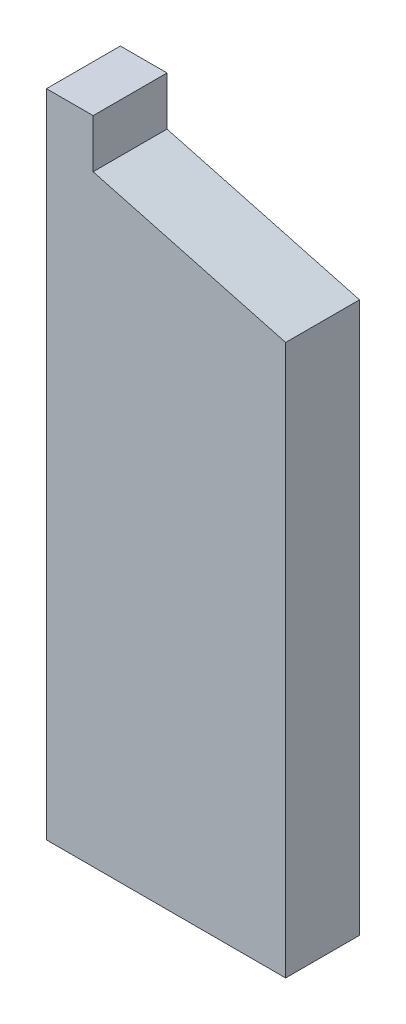
ISO-10303-21;
HEADER;
FILE_DESCRIPTION(('STEP AP214'),'2;1');
FILE_NAME('part.step','',(''),(''),'','','');
FILE_SCHEMA(('AUTOMOTIVE_DESIGN { 1 0 10303 214 1 1 1 1 }'));
ENDSEC;
DATA;
#1=APPLICATION_CONTEXT('core data for automotive mechanical design processes');
#2=APPLICATION_PROTOCOL_DEFINITION('international standard','automotive_design',2000,#1);
#3=PRODUCT_CONTEXT('',#1,'mechanical');
#4=PRODUCT('Part','Part','',(#3));
#5=PRODUCT_RELATED_PRODUCT_CATEGORY('part','',(#4));
#6=PRODUCT_DEFINITION_FORMATION('','',#4);
#7=PRODUCT_DEFINITION_CONTEXT('part definition',#1,'design');
#8=PRODUCT_DEFINITION('design','',#6,#7);
#9=PRODUCT_DEFINITION_SHAPE('','',#8);
#10=(LENGTH_UNIT() NAMED_UNIT(*) SI_UNIT(.MILLI.,.METRE.));
#11=(NAMED_UNIT(*) PLANE_ANGLE_UNIT() SI_UNIT($,.RADIAN.));
#12=(NAMED_UNIT(*) SI_UNIT($,.STERADIAN.) SOLID_ANGLE_UNIT());
#13=UNCERTAINTY_MEASURE_WITH_UNIT(LENGTH_MEASURE(1.E-05),#10,'distance_accuracy_value','');
#14=(GEOMETRIC_REPRESENTATION_CONTEXT(3) GLOBAL_UNCERTAINTY_ASSIGNED_CONTEXT((#13)) GLOBAL_UNIT_ASSIGNED_CONTEXT((#10,
#11,#12)) REPRESENTATION_CONTEXT('',''));
#15=CARTESIAN_POINT('',(0.,0.,0.));
#16=DIRECTION('',(0.,0.,1.));
#17=DIRECTION('',(1.,0.,0.));
#18=AXIS2_PLACEMENT_3D('',#15,#16,#17);
#19=CARTESIAN_POINT('',(24.6,0.,7.6));
#20=DIRECTION('',(1.,0.,0.));
#21=DIRECTION('',(0.,1.,0.));
#22=AXIS2_PLACEMENT_3D('',#19,#20,#21);
#23=PLANE('',#22);
#24=DIRECTION('',(0.,-1.,0.));
#25=VECTOR('',#24,1.);
#26=CARTESIAN_POINT('',(24.6,0.,0.));
#27=LINE('',#26,#25);
#28=CARTESIAN_POINT('',(24.6,-10.3053940101362,0.));
#29=VERTEX_POINT('',#28);
#30=CARTESIAN_POINT('',(24.6,-66.915,0.));
#31=VERTEX_POINT('',#30);
#32=EDGE_CURVE('E114',#29,#31,#27,.T.);
#33=ORIENTED_EDGE('',*,*,#32,.F.);
#34=DIRECTION('',(0.,0.,-1.));
#35=VECTOR('',#34,1.);
#36=CARTESIAN_POINT('',(24.6,-10.3053940101362,106.721924851358));
#37=LINE('',#36,#35);
#38=CARTESIAN_POINT('',(24.6,-10.3053940101362,7.6));
#39=VERTEX_POINT('',#38);
#40=EDGE_CURVE('E54',#39,#29,#37,.T.);
#41=ORIENTED_EDGE('',*,*,#40,.F.);
#42=DIRECTION('',(0.,-1.,0.));
#43=VECTOR('',#42,1.);
#44=CARTESIAN_POINT('',(24.6,0.,7.6));
#45=LINE('',#44,#43);
#46=CARTESIAN_POINT('',(24.6,-66.915,7.6));
#47=VERTEX_POINT('',#46);
#48=EDGE_CURVE('E119',#39,#47,#45,.T.);
#49=ORIENTED_EDGE('',*,*,#48,.T.);
#50=DIRECTION('',(0.,0.,-1.));
#51=VECTOR('',#50,1.);
#52=CARTESIAN_POINT('',(24.6,-66.915,7.6));
#53=LINE('',#52,#51);
#54=EDGE_CURVE('E121',#47,#31,#53,.T.);
#55=ORIENTED_EDGE('',*,*,#54,.T.);
#56=EDGE_LOOP('',(#33,#41,#49,#55));
#57=FACE_BOUND('',#56,.T.);
#58=ADVANCED_FACE('F39',(#57),#23,.T.);
#59=CARTESIAN_POINT('',(0.,0.,7.6));
#60=DIRECTION('',(0.,0.,1.));
#61=DIRECTION('',(1.,0.,0.));
#62=AXIS2_PLACEMENT_3D('',#59,#60,#61);
#63=PLANE('',#62);
#64=ORIENTED_EDGE('',*,*,#48,.F.);
#65=DIRECTION('',(-0.965925826289068,0.258819045102521,0.));
#66=VECTOR('',#65,1.);
#67=CARTESIAN_POINT('',(-0.928460969082654,-3.46506350946109,7.6));
#68=LINE('',#67,#66);
#69=CARTESIAN_POINT('',(4.8,-5.,7.6));
#70=VERTEX_POINT('',#69);
#71=EDGE_CURVE('E96',#39,#70,#68,.T.);
#72=ORIENTED_EDGE('',*,*,#71,.T.);
#73=DIRECTION('',(0.,-1.,0.));
#74=VECTOR('',#73,1.);
#75=CARTESIAN_POINT('',(4.8,0.,7.6));
#76=LINE('',#75,#74);
#77=CARTESIAN_POINT('',(4.8,0.,7.6));
#78=VERTEX_POINT('',#77);
#79=EDGE_CURVE('E101',#78,#70,#76,.T.);
#80=ORIENTED_EDGE('',*,*,#79,.F.);
#81=DIRECTION('',(1.,0.,0.));
#82=VECTOR('',#81,1.);
#83=CARTESIAN_POINT('',(0.,0.,7.6));
#84=LINE('',#83,#82);
#85=CARTESIAN_POINT('',(0.,0.,7.6));
#86=VERTEX_POINT('',#85);
#87=EDGE_CURVE('E109',#86,#78,#84,.T.);
#88=ORIENTED_EDGE('',*,*,#87,.F.);
#89=DIRECTION('',(0.,-1.,0.));
#90=VECTOR('',#89,1.);
#91=CARTESIAN_POINT('',(0.,0.,7.6));
#92=LINE('',#91,#90);
#93=CARTESIAN_POINT('',(0.,-66.915,7.6));
#94=VERTEX_POINT('',#93);
#95=EDGE_CURVE('E112',#86,#94,#92,.T.);
#96=ORIENTED_EDGE('',*,*,#95,.T.);
#97=DIRECTION('',(1.,0.,0.));
#98=VECTOR('',#97,1.);
#99=CARTESIAN_POINT('',(0.,-66.915,7.6));
#100=LINE('',#99,#98);
#101=EDGE_CURVE('E116',#94,#47,#100,.T.);
#102=ORIENTED_EDGE('',*,*,#101,.T.);
#103=EDGE_LOOP('',(#64,#72,#80,#88,#96,#102));
#104=FACE_BOUND('',#103,.T.);
#105=ADVANCED_FACE('F140',(#104),#63,.T.);
#106=CARTESIAN_POINT('',(0.,0.,0.));
#107=DIRECTION('',(0.,0.,1.));
#108=DIRECTION('',(1.,0.,0.));
#109=AXIS2_PLACEMENT_3D('',#106,#107,#108);
#110=PLANE('',#109);
#111=DIRECTION('',(-0.965925826289068,0.258819045102521,0.));
#112=VECTOR('',#111,1.);
#113=CARTESIAN_POINT('',(-0.928460969082654,-3.46506350946109,0.));
#114=LINE('',#113,#112);
#115=CARTESIAN_POINT('',(4.8,-5.,0.));
#116=VERTEX_POINT('',#115);
#117=EDGE_CURVE('E11',#29,#116,#114,.T.);
#118=ORIENTED_EDGE('',*,*,#117,.F.);
#119=ORIENTED_EDGE('',*,*,#32,.T.);
#120=DIRECTION('',(1.,0.,0.));
#121=VECTOR('',#120,1.);
#122=CARTESIAN_POINT('',(0.,-66.915,0.));
#123=LINE('',#122,#121);
#124=CARTESIAN_POINT('',(0.,-66.915,0.));
#125=VERTEX_POINT('',#124);
#126=EDGE_CURVE('E125',#125,#31,#123,.T.);
#127=ORIENTED_EDGE('',*,*,#126,.F.);
#128=DIRECTION('',(0.,-1.,0.));
#129=VECTOR('',#128,1.);
#130=CARTESIAN_POINT('',(0.,0.,0.));
#131=LINE('',#130,#129);
#132=CARTESIAN_POINT('',(0.,0.,0.));
#133=VERTEX_POINT('',#132);
#134=EDGE_CURVE('E122',#133,#125,#131,.T.);
#135=ORIENTED_EDGE('',*,*,#134,.F.);
#136=DIRECTION('',(1.,0.,0.));
#137=VECTOR('',#136,1.);
#138=CARTESIAN_POINT('',(0.,0.,0.));
#139=LINE('',#138,#137);
#140=CARTESIAN_POINT('',(4.8,0.,0.));
#141=VERTEX_POINT('',#140);
#142=EDGE_CURVE('E94',#133,#141,#139,.T.);
#143=ORIENTED_EDGE('',*,*,#142,.T.);
#144=DIRECTION('',(0.,-1.,0.));
#145=VECTOR('',#144,1.);
#146=CARTESIAN_POINT('',(4.8,0.,0.));
#147=LINE('',#146,#145);
#148=EDGE_CURVE('E89',#141,#116,#147,.T.);
#149=ORIENTED_EDGE('',*,*,#148,.T.);
#150=EDGE_LOOP('',(#118,#119,#127,#135,#143,#149));
#151=FACE_BOUND('',#150,.T.);
#152=ADVANCED_FACE('F91',(#151),#110,.F.);
#153=CARTESIAN_POINT('',(4.8,0.,7.6));
#154=DIRECTION('',(1.,0.,0.));
#155=DIRECTION('',(0.,1.,0.));
#156=AXIS2_PLACEMENT_3D('',#153,#154,#155);
#157=PLANE('',#156);
#158=ORIENTED_EDGE('',*,*,#148,.F.);
#159=DIRECTION('',(0.,0.,-1.));
#160=VECTOR('',#159,1.);
#161=CARTESIAN_POINT('',(4.8,0.,7.6));
#162=LINE('',#161,#160);
#163=EDGE_CURVE('E104',#78,#141,#162,.T.);
#164=ORIENTED_EDGE('',*,*,#163,.F.);
#165=ORIENTED_EDGE('',*,*,#79,.T.);
#166=DIRECTION('',(0.,0.,-1.));
#167=VECTOR('',#166,1.);
#168=CARTESIAN_POINT('',(4.8,-5.,7.6));
#169=LINE('',#168,#167);
#170=EDGE_CURVE('E47',#70,#116,#169,.T.);
#171=ORIENTED_EDGE('',*,*,#170,.T.);
#172=EDGE_LOOP('',(#158,#164,#165,#171));
#173=FACE_BOUND('',#172,.T.);
#174=ADVANCED_FACE('F41',(#173),#157,.T.);
#175=CARTESIAN_POINT('',(0.,0.,7.6));
#176=DIRECTION('',(0.,1.,0.));
#177=DIRECTION('',(-1.,0.,0.));
#178=AXIS2_PLACEMENT_3D('',#175,#176,#177);
#179=PLANE('',#178);
#180=ORIENTED_EDGE('',*,*,#142,.F.);
#181=DIRECTION('',(0.,0.,-1.));
#182=VECTOR('',#181,1.);
#183=CARTESIAN_POINT('',(0.,0.,7.6));
#184=LINE('',#183,#182);
#185=EDGE_CURVE('E134',#86,#133,#184,.T.);
#186=ORIENTED_EDGE('',*,*,#185,.F.);
#187=ORIENTED_EDGE('',*,*,#87,.T.);
#188=ORIENTED_EDGE('',*,*,#163,.T.);
#189=EDGE_LOOP('',(#180,#186,#187,#188));
#190=FACE_BOUND('',#189,.T.);
#191=ADVANCED_FACE('F137',(#190),#179,.T.);
#192=CARTESIAN_POINT('',(0.,0.,7.6));
#193=DIRECTION('',(1.,0.,0.));
#194=DIRECTION('',(0.,1.,0.));
#195=AXIS2_PLACEMENT_3D('',#192,#193,#194);
#196=PLANE('',#195);
#197=ORIENTED_EDGE('',*,*,#134,.T.);
#198=DIRECTION('',(0.,0.,-1.));
#199=VECTOR('',#198,1.);
#200=CARTESIAN_POINT('',(0.,-66.915,7.6));
#201=LINE('',#200,#199);
#202=EDGE_CURVE('E131',#94,#125,#201,.T.);
#203=ORIENTED_EDGE('',*,*,#202,.F.);
#204=ORIENTED_EDGE('',*,*,#95,.F.);
#205=ORIENTED_EDGE('',*,*,#185,.T.);
#206=EDGE_LOOP('',(#197,#203,#204,#205));
#207=FACE_BOUND('',#206,.T.);
#208=ADVANCED_FACE('F148',(#207),#196,.F.);
#209=CARTESIAN_POINT('',(0.,-66.915,7.6));
#210=DIRECTION('',(0.,1.,0.));
#211=DIRECTION('',(0.,0.,1.));
#212=AXIS2_PLACEMENT_3D('',#209,#210,#211);
#213=PLANE('',#212);
#214=ORIENTED_EDGE('',*,*,#126,.T.);
#215=ORIENTED_EDGE('',*,*,#54,.F.);
#216=ORIENTED_EDGE('',*,*,#101,.F.);
#217=ORIENTED_EDGE('',*,*,#202,.T.);
#218=EDGE_LOOP('',(#214,#215,#216,#217));
#219=FACE_BOUND('',#218,.T.);
#220=ADVANCED_FACE('F145',(#219),#213,.F.);
#221=CARTESIAN_POINT('',(4.8,-5.,106.721924851358));
#222=DIRECTION('',(0.258819045102521,0.965925826289068,0.));
#223=DIRECTION('',(-0.965925826289068,0.258819045102521,0.));
#224=AXIS2_PLACEMENT_3D('',#221,#222,#223);
#225=PLANE('',#224);
#226=ORIENTED_EDGE('',*,*,#71,.F.);
#227=ORIENTED_EDGE('',*,*,#40,.T.);
#228=ORIENTED_EDGE('',*,*,#117,.T.);
#229=ORIENTED_EDGE('',*,*,#170,.F.);
#230=EDGE_LOOP('',(#226,#227,#228,#229));
#231=FACE_BOUND('',#230,.T.);
#232=ADVANCED_FACE('F105',(#231),#225,.T.);
#233=CLOSED_SHELL('',(#58,#105,#152,#174,#191,#208,#220,#232));
#234=MANIFOLD_SOLID_BREP('B2',#233);
#235=ADVANCED_BREP_SHAPE_REPRESENTATION('',(#18,#234),#14);
#236=SHAPE_DEFINITION_REPRESENTATION(#9,#235);
ENDSEC;
END-ISO-10303-21;
